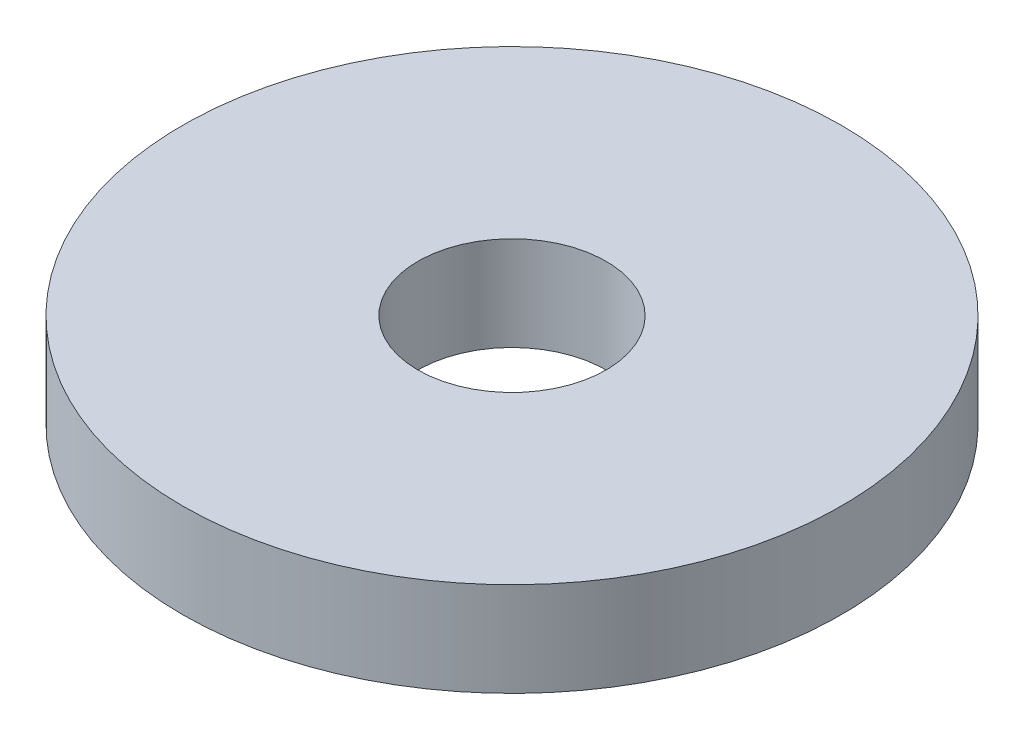
ISO-10303-21;
HEADER;
FILE_DESCRIPTION(('STEP AP214'),'2;1');
FILE_NAME('part.step','',(''),(''),'','','');
FILE_SCHEMA(('AUTOMOTIVE_DESIGN { 1 0 10303 214 1 1 1 1 }'));
ENDSEC;
DATA;
#1=APPLICATION_CONTEXT('core data for automotive mechanical design processes');
#2=APPLICATION_PROTOCOL_DEFINITION('international standard','automotive_design',2000,#1);
#3=PRODUCT_CONTEXT('',#1,'mechanical');
#4=PRODUCT('Part','Part','',(#3));
#5=PRODUCT_RELATED_PRODUCT_CATEGORY('part','',(#4));
#6=PRODUCT_DEFINITION_FORMATION('','',#4);
#7=PRODUCT_DEFINITION_CONTEXT('part definition',#1,'design');
#8=PRODUCT_DEFINITION('design','',#6,#7);
#9=PRODUCT_DEFINITION_SHAPE('','',#8);
#10=(LENGTH_UNIT() NAMED_UNIT(*) SI_UNIT(.MILLI.,.METRE.));
#11=(NAMED_UNIT(*) PLANE_ANGLE_UNIT() SI_UNIT($,.RADIAN.));
#12=(NAMED_UNIT(*) SI_UNIT($,.STERADIAN.) SOLID_ANGLE_UNIT());
#13=UNCERTAINTY_MEASURE_WITH_UNIT(LENGTH_MEASURE(1.E-05),#10,'distance_accuracy_value','');
#14=(GEOMETRIC_REPRESENTATION_CONTEXT(3) GLOBAL_UNCERTAINTY_ASSIGNED_CONTEXT((#13)) GLOBAL_UNIT_ASSIGNED_CONTEXT((#10,
#11,#12)) REPRESENTATION_CONTEXT('',''));
#15=CARTESIAN_POINT('',(0.,0.,0.));
#16=DIRECTION('',(0.,0.,1.));
#17=DIRECTION('',(1.,0.,0.));
#18=AXIS2_PLACEMENT_3D('',#15,#16,#17);
#19=CARTESIAN_POINT('',(0.,2.,0.));
#20=DIRECTION('',(0.,1.,0.));
#21=DIRECTION('',(0.,0.,1.));
#22=AXIS2_PLACEMENT_3D('',#19,#20,#21);
#23=PLANE('',#22);
#24=CARTESIAN_POINT('',(0.,2.,0.));
#25=DIRECTION('',(0.,1.,0.));
#26=DIRECTION('',(0.,0.,1.));
#27=AXIS2_PLACEMENT_3D('',#24,#25,#26);
#28=CIRCLE('',#27,7.);
#29=CARTESIAN_POINT('',(0.,2.,7.));
#30=VERTEX_POINT('',#29);
#31=EDGE_CURVE('E10',#30,#30,#28,.T.);
#32=ORIENTED_EDGE('',*,*,#31,.T.);
#33=EDGE_LOOP('',(#32));
#34=FACE_BOUND('',#33,.T.);
#35=CARTESIAN_POINT('',(0.,2.,0.));
#36=DIRECTION('',(0.,1.,0.));
#37=DIRECTION('',(0.,0.,1.));
#38=AXIS2_PLACEMENT_3D('',#35,#36,#37);
#39=CIRCLE('',#38,2.);
#40=CARTESIAN_POINT('',(0.,2.,2.));
#41=VERTEX_POINT('',#40);
#42=EDGE_CURVE('E54',#41,#41,#39,.T.);
#43=ORIENTED_EDGE('',*,*,#42,.F.);
#44=EDGE_LOOP('',(#43));
#45=FACE_BOUND('',#44,.T.);
#46=ADVANCED_FACE('F41',(#34,#45),#23,.T.);
#47=CARTESIAN_POINT('',(0.,0.,0.));
#48=DIRECTION('',(0.,1.,0.));
#49=DIRECTION('',(0.,0.,1.));
#50=AXIS2_PLACEMENT_3D('',#47,#48,#49);
#51=PLANE('',#50);
#52=CARTESIAN_POINT('',(0.,0.,0.));
#53=DIRECTION('',(0.,1.,0.));
#54=DIRECTION('',(0.,0.,1.));
#55=AXIS2_PLACEMENT_3D('',#52,#53,#54);
#56=CIRCLE('',#55,7.);
#57=CARTESIAN_POINT('',(0.,0.,7.));
#58=VERTEX_POINT('',#57);
#59=EDGE_CURVE('E45',#58,#58,#56,.T.);
#60=ORIENTED_EDGE('',*,*,#59,.F.);
#61=EDGE_LOOP('',(#60));
#62=FACE_BOUND('',#61,.T.);
#63=CARTESIAN_POINT('',(0.,0.,0.));
#64=DIRECTION('',(0.,1.,0.));
#65=DIRECTION('',(0.,0.,1.));
#66=AXIS2_PLACEMENT_3D('',#63,#64,#65);
#67=CIRCLE('',#66,2.);
#68=CARTESIAN_POINT('',(0.,0.,2.));
#69=VERTEX_POINT('',#68);
#70=EDGE_CURVE('E56',#69,#69,#67,.T.);
#71=ORIENTED_EDGE('',*,*,#70,.T.);
#72=EDGE_LOOP('',(#71));
#73=FACE_BOUND('',#72,.T.);
#74=ADVANCED_FACE('F68',(#62,#73),#51,.F.);
#75=CARTESIAN_POINT('',(0.,2.,0.));
#76=DIRECTION('',(0.,-1.,0.));
#77=DIRECTION('',(0.,0.,-1.));
#78=AXIS2_PLACEMENT_3D('',#75,#76,#77);
#79=CYLINDRICAL_SURFACE('',#78,7.);
#80=ORIENTED_EDGE('',*,*,#31,.F.);
#81=EDGE_LOOP('',(#80));
#82=FACE_BOUND('',#81,.T.);
#83=ORIENTED_EDGE('',*,*,#59,.T.);
#84=EDGE_LOOP('',(#83));
#85=FACE_BOUND('',#84,.T.);
#86=ADVANCED_FACE('F43',(#82,#85),#79,.T.);
#87=CARTESIAN_POINT('',(0.,2.,0.));
#88=DIRECTION('',(0.,-1.,0.));
#89=DIRECTION('',(0.,0.,-1.));
#90=AXIS2_PLACEMENT_3D('',#87,#88,#89);
#91=CYLINDRICAL_SURFACE('',#90,2.);
#92=ORIENTED_EDGE('',*,*,#42,.T.);
#93=EDGE_LOOP('',(#92));
#94=FACE_BOUND('',#93,.T.);
#95=ORIENTED_EDGE('',*,*,#70,.F.);
#96=EDGE_LOOP('',(#95));
#97=FACE_BOUND('',#96,.T.);
#98=ADVANCED_FACE('F64',(#94,#97),#91,.F.);
#99=CLOSED_SHELL('',(#46,#74,#86,#98));
#100=MANIFOLD_SOLID_BREP('B2',#99);
#101=ADVANCED_BREP_SHAPE_REPRESENTATION('',(#18,#100),#14);
#102=SHAPE_DEFINITION_REPRESENTATION(#9,#101);
ENDSEC;
END-ISO-10303-21;
